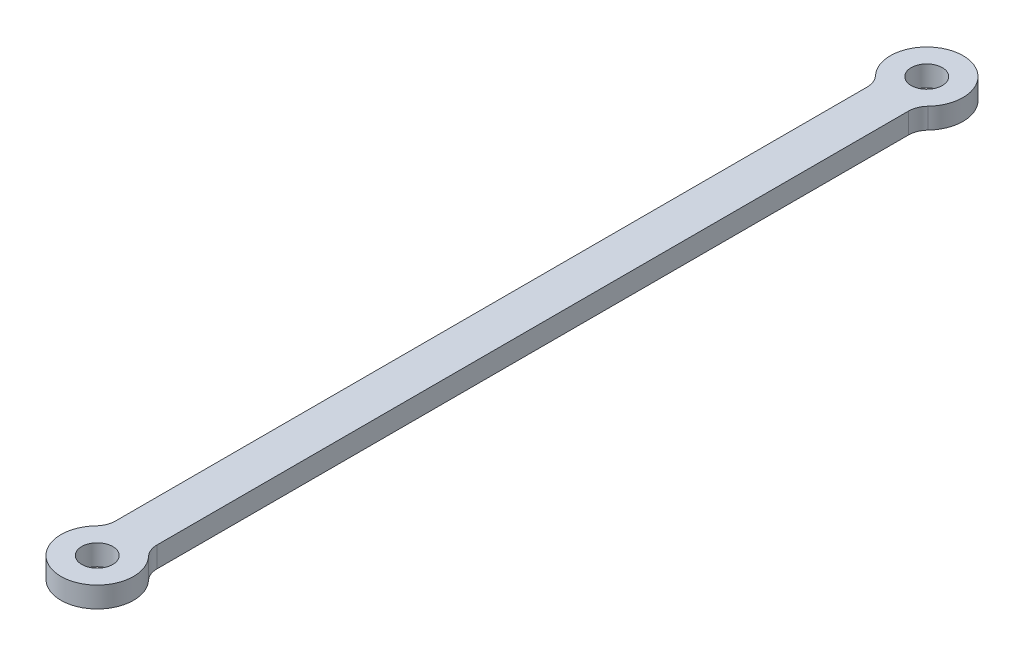
ISO-10303-21;
HEADER;
FILE_DESCRIPTION(('STEP AP214'),'2;1');
FILE_NAME('part.step','',(''),(''),'','','');
FILE_SCHEMA(('AUTOMOTIVE_DESIGN { 1 0 10303 214 1 1 1 1 }'));
ENDSEC;
DATA;
#1=APPLICATION_CONTEXT('core data for automotive mechanical design processes');
#2=APPLICATION_PROTOCOL_DEFINITION('international standard','automotive_design',2000,#1);
#3=PRODUCT_CONTEXT('',#1,'mechanical');
#4=PRODUCT('Part','Part','',(#3));
#5=PRODUCT_RELATED_PRODUCT_CATEGORY('part','',(#4));
#6=PRODUCT_DEFINITION_FORMATION('','',#4);
#7=PRODUCT_DEFINITION_CONTEXT('part definition',#1,'design');
#8=PRODUCT_DEFINITION('design','',#6,#7);
#9=PRODUCT_DEFINITION_SHAPE('','',#8);
#10=(LENGTH_UNIT() NAMED_UNIT(*) SI_UNIT(.MILLI.,.METRE.));
#11=(NAMED_UNIT(*) PLANE_ANGLE_UNIT() SI_UNIT($,.RADIAN.));
#12=(NAMED_UNIT(*) SI_UNIT($,.STERADIAN.) SOLID_ANGLE_UNIT());
#13=UNCERTAINTY_MEASURE_WITH_UNIT(LENGTH_MEASURE(1.E-05),#10,'distance_accuracy_value','');
#14=(GEOMETRIC_REPRESENTATION_CONTEXT(3) GLOBAL_UNCERTAINTY_ASSIGNED_CONTEXT((#13)) GLOBAL_UNIT_ASSIGNED_CONTEXT((#10,
#11,#12)) REPRESENTATION_CONTEXT('',''));
#15=CARTESIAN_POINT('',(0.,0.,0.));
#16=DIRECTION('',(0.,0.,1.));
#17=DIRECTION('',(1.,0.,0.));
#18=AXIS2_PLACEMENT_3D('',#15,#16,#17);
#19=CARTESIAN_POINT('',(0.,2.54,0.));
#20=DIRECTION('',(0.,1.,0.));
#21=DIRECTION('',(0.,0.,1.));
#22=AXIS2_PLACEMENT_3D('',#19,#20,#21);
#23=PLANE('',#22);
#24=CARTESIAN_POINT('',(0.,2.54,-101.6));
#25=DIRECTION('',(0.,1.,0.));
#26=DIRECTION('',(0.,0.,1.));
#27=AXIS2_PLACEMENT_3D('',#24,#25,#26);
#28=CIRCLE('',#27,1.905);
#29=CARTESIAN_POINT('',(0.,2.54,-99.695));
#30=VERTEX_POINT('',#29);
#31=EDGE_CURVE('E146',#30,#30,#28,.T.);
#32=ORIENTED_EDGE('',*,*,#31,.F.);
#33=EDGE_LOOP('',(#32));
#34=FACE_BOUND('',#33,.T.);
#35=DIRECTION('',(0.,0.,1.));
#36=VECTOR('',#35,1.);
#37=CARTESIAN_POINT('',(-2.54,2.54,-3.64779728055165));
#38=LINE('',#37,#36);
#39=CARTESIAN_POINT('',(-2.54,2.54,-96.8058551336031));
#40=VERTEX_POINT('',#39);
#41=CARTESIAN_POINT('',(-2.54,2.54,-4.79414486639693));
#42=VERTEX_POINT('',#41);
#43=EDGE_CURVE('E155',#40,#42,#38,.T.);
#44=ORIENTED_EDGE('',*,*,#43,.T.);
#45=CARTESIAN_POINT('',(-5.08,2.54,-4.79414486639693));
#46=DIRECTION('',(0.,1.,0.));
#47=DIRECTION('',(0.,0.,1.));
#48=AXIS2_PLACEMENT_3D('',#45,#46,#47);
#49=CIRCLE('',#48,2.54);
#50=CARTESIAN_POINT('',(-3.23272727272727,2.54,-3.05081946043441));
#51=VERTEX_POINT('',#50);
#52=EDGE_CURVE('E180',#42,#51,#49,.F.);
#53=ORIENTED_EDGE('',*,*,#52,.T.);
#54=CARTESIAN_POINT('',(0.,2.54,0.));
#55=DIRECTION('',(0.,1.,0.));
#56=DIRECTION('',(0.,0.,1.));
#57=AXIS2_PLACEMENT_3D('',#54,#55,#56);
#58=CIRCLE('',#57,4.445);
#59=CARTESIAN_POINT('',(3.23272727272727,2.54,-3.05081946043441));
#60=VERTEX_POINT('',#59);
#61=EDGE_CURVE('E153',#51,#60,#58,.T.);
#62=ORIENTED_EDGE('',*,*,#61,.T.);
#63=CARTESIAN_POINT('',(5.08,2.54,-4.79414486639693));
#64=DIRECTION('',(0.,1.,0.));
#65=DIRECTION('',(0.,0.,1.));
#66=AXIS2_PLACEMENT_3D('',#63,#64,#65);
#67=CIRCLE('',#66,2.54);
#68=CARTESIAN_POINT('',(2.54,2.54,-4.79414486639693));
#69=VERTEX_POINT('',#68);
#70=EDGE_CURVE('E122',#60,#69,#67,.F.);
#71=ORIENTED_EDGE('',*,*,#70,.T.);
#72=DIRECTION('',(0.,0.,-1.));
#73=VECTOR('',#72,1.);
#74=CARTESIAN_POINT('',(2.54,2.54,-3.64779728055165));
#75=LINE('',#74,#73);
#76=CARTESIAN_POINT('',(2.54,2.54,-96.8058551336031));
#77=VERTEX_POINT('',#76);
#78=EDGE_CURVE('E130',#69,#77,#75,.T.);
#79=ORIENTED_EDGE('',*,*,#78,.T.);
#80=CARTESIAN_POINT('',(5.08,2.54,-96.8058551336031));
#81=DIRECTION('',(0.,1.,0.));
#82=DIRECTION('',(0.,0.,1.));
#83=AXIS2_PLACEMENT_3D('',#80,#81,#82);
#84=CIRCLE('',#83,2.54);
#85=CARTESIAN_POINT('',(3.23272727272727,2.54,-98.5491805395656));
#86=VERTEX_POINT('',#85);
#87=EDGE_CURVE('E11',#77,#86,#84,.F.);
#88=ORIENTED_EDGE('',*,*,#87,.T.);
#89=CARTESIAN_POINT('',(0.,2.54,-101.6));
#90=DIRECTION('',(0.,1.,0.));
#91=DIRECTION('',(0.,0.,1.));
#92=AXIS2_PLACEMENT_3D('',#89,#90,#91);
#93=CIRCLE('',#92,4.445);
#94=CARTESIAN_POINT('',(-3.23272727272727,2.54,-98.5491805395656));
#95=VERTEX_POINT('',#94);
#96=EDGE_CURVE('E192',#86,#95,#93,.T.);
#97=ORIENTED_EDGE('',*,*,#96,.T.);
#98=CARTESIAN_POINT('',(-5.08,2.54,-96.8058551336031));
#99=DIRECTION('',(0.,1.,0.));
#100=DIRECTION('',(0.,0.,1.));
#101=AXIS2_PLACEMENT_3D('',#98,#99,#100);
#102=CIRCLE('',#101,2.54);
#103=EDGE_CURVE('E186',#95,#40,#102,.F.);
#104=ORIENTED_EDGE('',*,*,#103,.T.);
#105=EDGE_LOOP('',(#44,#53,#62,#71,#79,#88,#97,#104));
#106=FACE_BOUND('',#105,.T.);
#107=CARTESIAN_POINT('',(0.,2.54,0.));
#108=DIRECTION('',(0.,1.,0.));
#109=DIRECTION('',(0.,0.,1.));
#110=AXIS2_PLACEMENT_3D('',#107,#108,#109);
#111=CIRCLE('',#110,1.905);
#112=CARTESIAN_POINT('',(0.,2.54,1.905));
#113=VERTEX_POINT('',#112);
#114=EDGE_CURVE('E205',#113,#113,#111,.T.);
#115=ORIENTED_EDGE('',*,*,#114,.F.);
#116=EDGE_LOOP('',(#115));
#117=FACE_BOUND('',#116,.T.);
#118=ADVANCED_FACE('F45',(#34,#106,#117),#23,.T.);
#119=CARTESIAN_POINT('',(0.,0.,0.));
#120=DIRECTION('',(0.,1.,0.));
#121=DIRECTION('',(0.,0.,1.));
#122=AXIS2_PLACEMENT_3D('',#119,#120,#121);
#123=PLANE('',#122);
#124=CARTESIAN_POINT('',(0.,0.,0.));
#125=DIRECTION('',(0.,1.,0.));
#126=DIRECTION('',(0.,0.,1.));
#127=AXIS2_PLACEMENT_3D('',#124,#125,#126);
#128=CIRCLE('',#127,4.445);
#129=CARTESIAN_POINT('',(-3.23272727272727,0.,-3.05081946043441));
#130=VERTEX_POINT('',#129);
#131=CARTESIAN_POINT('',(3.23272727272727,0.,-3.05081946043441));
#132=VERTEX_POINT('',#131);
#133=EDGE_CURVE('E140',#130,#132,#128,.T.);
#134=ORIENTED_EDGE('',*,*,#133,.F.);
#135=CARTESIAN_POINT('',(-5.08,0.,-4.79414486639693));
#136=DIRECTION('',(0.,1.,0.));
#137=DIRECTION('',(0.,0.,1.));
#138=AXIS2_PLACEMENT_3D('',#135,#136,#137);
#139=CIRCLE('',#138,2.54);
#140=CARTESIAN_POINT('',(-2.54,0.,-4.79414486639693));
#141=VERTEX_POINT('',#140);
#142=EDGE_CURVE('E177',#130,#141,#139,.T.);
#143=ORIENTED_EDGE('',*,*,#142,.T.);
#144=DIRECTION('',(0.,0.,1.));
#145=VECTOR('',#144,1.);
#146=CARTESIAN_POINT('',(-2.54,0.,-3.64779728055165));
#147=LINE('',#146,#145);
#148=CARTESIAN_POINT('',(-2.54,0.,-96.8058551336031));
#149=VERTEX_POINT('',#148);
#150=EDGE_CURVE('E144',#149,#141,#147,.T.);
#151=ORIENTED_EDGE('',*,*,#150,.F.);
#152=CARTESIAN_POINT('',(-5.08,0.,-96.8058551336031));
#153=DIRECTION('',(0.,1.,0.));
#154=DIRECTION('',(0.,0.,1.));
#155=AXIS2_PLACEMENT_3D('',#152,#153,#154);
#156=CIRCLE('',#155,2.54);
#157=CARTESIAN_POINT('',(-3.23272727272727,0.,-98.5491805395656));
#158=VERTEX_POINT('',#157);
#159=EDGE_CURVE('E183',#149,#158,#156,.T.);
#160=ORIENTED_EDGE('',*,*,#159,.T.);
#161=CARTESIAN_POINT('',(0.,0.,-101.6));
#162=DIRECTION('',(0.,1.,0.));
#163=DIRECTION('',(0.,0.,1.));
#164=AXIS2_PLACEMENT_3D('',#161,#162,#163);
#165=CIRCLE('',#164,4.445);
#166=CARTESIAN_POINT('',(3.23272727272727,0.,-98.5491805395656));
#167=VERTEX_POINT('',#166);
#168=EDGE_CURVE('E139',#167,#158,#165,.T.);
#169=ORIENTED_EDGE('',*,*,#168,.F.);
#170=CARTESIAN_POINT('',(5.08,0.,-96.8058551336031));
#171=DIRECTION('',(0.,1.,0.));
#172=DIRECTION('',(0.,0.,1.));
#173=AXIS2_PLACEMENT_3D('',#170,#171,#172);
#174=CIRCLE('',#173,2.54);
#175=CARTESIAN_POINT('',(2.54,0.,-96.8058551336031));
#176=VERTEX_POINT('',#175);
#177=EDGE_CURVE('E54',#167,#176,#174,.T.);
#178=ORIENTED_EDGE('',*,*,#177,.T.);
#179=DIRECTION('',(0.,0.,-1.));
#180=VECTOR('',#179,1.);
#181=CARTESIAN_POINT('',(2.54,0.,-3.64779728055165));
#182=LINE('',#181,#180);
#183=CARTESIAN_POINT('',(2.54,0.,-4.79414486639693));
#184=VERTEX_POINT('',#183);
#185=EDGE_CURVE('E128',#184,#176,#182,.T.);
#186=ORIENTED_EDGE('',*,*,#185,.F.);
#187=CARTESIAN_POINT('',(5.08,0.,-4.79414486639693));
#188=DIRECTION('',(0.,1.,0.));
#189=DIRECTION('',(0.,0.,1.));
#190=AXIS2_PLACEMENT_3D('',#187,#188,#189);
#191=CIRCLE('',#190,2.54);
#192=EDGE_CURVE('E111',#184,#132,#191,.T.);
#193=ORIENTED_EDGE('',*,*,#192,.T.);
#194=EDGE_LOOP('',(#134,#143,#151,#160,#169,#178,#186,#193));
#195=FACE_BOUND('',#194,.T.);
#196=CARTESIAN_POINT('',(0.,0.,-101.6));
#197=DIRECTION('',(0.,1.,0.));
#198=DIRECTION('',(0.,0.,1.));
#199=AXIS2_PLACEMENT_3D('',#196,#197,#198);
#200=CIRCLE('',#199,1.905);
#201=CARTESIAN_POINT('',(0.,0.,-99.695));
#202=VERTEX_POINT('',#201);
#203=EDGE_CURVE('E201',#202,#202,#200,.T.);
#204=ORIENTED_EDGE('',*,*,#203,.T.);
#205=EDGE_LOOP('',(#204));
#206=FACE_BOUND('',#205,.T.);
#207=CARTESIAN_POINT('',(0.,0.,0.));
#208=DIRECTION('',(0.,1.,0.));
#209=DIRECTION('',(0.,0.,1.));
#210=AXIS2_PLACEMENT_3D('',#207,#208,#209);
#211=CIRCLE('',#210,1.905);
#212=CARTESIAN_POINT('',(0.,0.,1.905));
#213=VERTEX_POINT('',#212);
#214=EDGE_CURVE('E209',#213,#213,#211,.T.);
#215=ORIENTED_EDGE('',*,*,#214,.T.);
#216=EDGE_LOOP('',(#215));
#217=FACE_BOUND('',#216,.T.);
#218=ADVANCED_FACE('F135',(#195,#206,#217),#123,.F.);
#219=CARTESIAN_POINT('',(0.,2.54,0.));
#220=DIRECTION('',(0.,-1.,0.));
#221=DIRECTION('',(0.,0.,-1.));
#222=AXIS2_PLACEMENT_3D('',#219,#220,#221);
#223=CYLINDRICAL_SURFACE('',#222,4.445);
#224=ORIENTED_EDGE('',*,*,#133,.T.);
#225=DIRECTION('',(0.,-1.,0.));
#226=VECTOR('',#225,1.);
#227=CARTESIAN_POINT('',(3.23272727272727,2.54,-3.05081946043441));
#228=LINE('',#227,#226);
#229=EDGE_CURVE('E116',#132,#60,#228,.F.);
#230=ORIENTED_EDGE('',*,*,#229,.T.);
#231=ORIENTED_EDGE('',*,*,#61,.F.);
#232=DIRECTION('',(0.,-1.,0.));
#233=VECTOR('',#232,1.);
#234=CARTESIAN_POINT('',(-3.23272727272727,2.54,-3.05081946043441));
#235=LINE('',#234,#233);
#236=EDGE_CURVE('E132',#51,#130,#235,.T.);
#237=ORIENTED_EDGE('',*,*,#236,.T.);
#238=EDGE_LOOP('',(#224,#230,#231,#237));
#239=FACE_BOUND('',#238,.T.);
#240=ADVANCED_FACE('F227',(#239),#223,.T.);
#241=CARTESIAN_POINT('',(2.54,2.54,-3.64779728055165));
#242=DIRECTION('',(-1.,0.,0.));
#243=DIRECTION('',(0.,0.,1.));
#244=AXIS2_PLACEMENT_3D('',#241,#242,#243);
#245=PLANE('',#244);
#246=ORIENTED_EDGE('',*,*,#78,.F.);
#247=DIRECTION('',(0.,1.,0.));
#248=VECTOR('',#247,1.);
#249=CARTESIAN_POINT('',(2.54,0.,-4.79414486639693));
#250=LINE('',#249,#248);
#251=EDGE_CURVE('E115',#69,#184,#250,.F.);
#252=ORIENTED_EDGE('',*,*,#251,.T.);
#253=ORIENTED_EDGE('',*,*,#185,.T.);
#254=DIRECTION('',(0.,1.,0.));
#255=VECTOR('',#254,1.);
#256=CARTESIAN_POINT('',(2.54,2.54,-96.8058551336031));
#257=LINE('',#256,#255);
#258=EDGE_CURVE('E133',#176,#77,#257,.T.);
#259=ORIENTED_EDGE('',*,*,#258,.T.);
#260=EDGE_LOOP('',(#246,#252,#253,#259));
#261=FACE_BOUND('',#260,.T.);
#262=ADVANCED_FACE('F127',(#261),#245,.F.);
#263=CARTESIAN_POINT('',(0.,2.54,-101.6));
#264=DIRECTION('',(0.,-1.,0.));
#265=DIRECTION('',(0.,0.,-1.));
#266=AXIS2_PLACEMENT_3D('',#263,#264,#265);
#267=CYLINDRICAL_SURFACE('',#266,4.445);
#268=ORIENTED_EDGE('',*,*,#168,.T.);
#269=DIRECTION('',(0.,-1.,0.));
#270=VECTOR('',#269,1.);
#271=CARTESIAN_POINT('',(-3.23272727272727,2.54,-98.5491805395656));
#272=LINE('',#271,#270);
#273=EDGE_CURVE('E61',#158,#95,#272,.F.);
#274=ORIENTED_EDGE('',*,*,#273,.T.);
#275=ORIENTED_EDGE('',*,*,#96,.F.);
#276=DIRECTION('',(0.,-1.,0.));
#277=VECTOR('',#276,1.);
#278=CARTESIAN_POINT('',(3.23272727272727,2.54,-98.5491805395656));
#279=LINE('',#278,#277);
#280=EDGE_CURVE('E169',#86,#167,#279,.T.);
#281=ORIENTED_EDGE('',*,*,#280,.T.);
#282=EDGE_LOOP('',(#268,#274,#275,#281));
#283=FACE_BOUND('',#282,.T.);
#284=ADVANCED_FACE('F237',(#283),#267,.T.);
#285=CARTESIAN_POINT('',(-2.54,2.54,-3.64779728055165));
#286=DIRECTION('',(1.,0.,0.));
#287=DIRECTION('',(0.,0.,-1.));
#288=AXIS2_PLACEMENT_3D('',#285,#286,#287);
#289=PLANE('',#288);
#290=ORIENTED_EDGE('',*,*,#150,.T.);
#291=DIRECTION('',(0.,1.,0.));
#292=VECTOR('',#291,1.);
#293=CARTESIAN_POINT('',(-2.54,2.54,-4.79414486639693));
#294=LINE('',#293,#292);
#295=EDGE_CURVE('E166',#141,#42,#294,.T.);
#296=ORIENTED_EDGE('',*,*,#295,.T.);
#297=ORIENTED_EDGE('',*,*,#43,.F.);
#298=DIRECTION('',(0.,1.,0.));
#299=VECTOR('',#298,1.);
#300=CARTESIAN_POINT('',(-2.54,0.,-96.8058551336031));
#301=LINE('',#300,#299);
#302=EDGE_CURVE('E162',#40,#149,#301,.F.);
#303=ORIENTED_EDGE('',*,*,#302,.T.);
#304=EDGE_LOOP('',(#290,#296,#297,#303));
#305=FACE_BOUND('',#304,.T.);
#306=ADVANCED_FACE('F234',(#305),#289,.F.);
#307=CARTESIAN_POINT('',(0.,2.54,-101.6));
#308=DIRECTION('',(0.,-1.,0.));
#309=DIRECTION('',(0.,0.,-1.));
#310=AXIS2_PLACEMENT_3D('',#307,#308,#309);
#311=CYLINDRICAL_SURFACE('',#310,1.905);
#312=ORIENTED_EDGE('',*,*,#31,.T.);
#313=EDGE_LOOP('',(#312));
#314=FACE_BOUND('',#313,.T.);
#315=ORIENTED_EDGE('',*,*,#203,.F.);
#316=EDGE_LOOP('',(#315));
#317=FACE_BOUND('',#316,.T.);
#318=ADVANCED_FACE('F231',(#314,#317),#311,.F.);
#319=CARTESIAN_POINT('',(0.,2.54,0.));
#320=DIRECTION('',(0.,-1.,0.));
#321=DIRECTION('',(0.,0.,-1.));
#322=AXIS2_PLACEMENT_3D('',#319,#320,#321);
#323=CYLINDRICAL_SURFACE('',#322,1.905);
#324=ORIENTED_EDGE('',*,*,#114,.T.);
#325=EDGE_LOOP('',(#324));
#326=FACE_BOUND('',#325,.T.);
#327=ORIENTED_EDGE('',*,*,#214,.F.);
#328=EDGE_LOOP('',(#327));
#329=FACE_BOUND('',#328,.T.);
#330=ADVANCED_FACE('F217',(#326,#329),#323,.F.);
#331=CARTESIAN_POINT('',(5.08,2.54,-4.79414486639693));
#332=DIRECTION('',(0.,-1.,0.));
#333=DIRECTION('',(0.,0.,-1.));
#334=AXIS2_PLACEMENT_3D('',#331,#332,#333);
#335=CYLINDRICAL_SURFACE('',#334,2.54);
#336=ORIENTED_EDGE('',*,*,#70,.F.);
#337=ORIENTED_EDGE('',*,*,#229,.F.);
#338=ORIENTED_EDGE('',*,*,#192,.F.);
#339=ORIENTED_EDGE('',*,*,#251,.F.);
#340=EDGE_LOOP('',(#336,#337,#338,#339));
#341=FACE_BOUND('',#340,.T.);
#342=ADVANCED_FACE('F114',(#341),#335,.F.);
#343=CARTESIAN_POINT('',(-5.08,2.54,-4.79414486639693));
#344=DIRECTION('',(0.,-1.,0.));
#345=DIRECTION('',(0.,0.,-1.));
#346=AXIS2_PLACEMENT_3D('',#343,#344,#345);
#347=CYLINDRICAL_SURFACE('',#346,2.54);
#348=ORIENTED_EDGE('',*,*,#52,.F.);
#349=ORIENTED_EDGE('',*,*,#295,.F.);
#350=ORIENTED_EDGE('',*,*,#142,.F.);
#351=ORIENTED_EDGE('',*,*,#236,.F.);
#352=EDGE_LOOP('',(#348,#349,#350,#351));
#353=FACE_BOUND('',#352,.T.);
#354=ADVANCED_FACE('F248',(#353),#347,.F.);
#355=CARTESIAN_POINT('',(-5.08,2.54,-96.8058551336031));
#356=DIRECTION('',(0.,-1.,0.));
#357=DIRECTION('',(0.,0.,-1.));
#358=AXIS2_PLACEMENT_3D('',#355,#356,#357);
#359=CYLINDRICAL_SURFACE('',#358,2.54);
#360=ORIENTED_EDGE('',*,*,#103,.F.);
#361=ORIENTED_EDGE('',*,*,#273,.F.);
#362=ORIENTED_EDGE('',*,*,#159,.F.);
#363=ORIENTED_EDGE('',*,*,#302,.F.);
#364=EDGE_LOOP('',(#360,#361,#362,#363));
#365=FACE_BOUND('',#364,.T.);
#366=ADVANCED_FACE('F250',(#365),#359,.F.);
#367=CARTESIAN_POINT('',(5.08,2.54,-96.8058551336031));
#368=DIRECTION('',(0.,-1.,0.));
#369=DIRECTION('',(0.,0.,-1.));
#370=AXIS2_PLACEMENT_3D('',#367,#368,#369);
#371=CYLINDRICAL_SURFACE('',#370,2.54);
#372=ORIENTED_EDGE('',*,*,#87,.F.);
#373=ORIENTED_EDGE('',*,*,#258,.F.);
#374=ORIENTED_EDGE('',*,*,#177,.F.);
#375=ORIENTED_EDGE('',*,*,#280,.F.);
#376=EDGE_LOOP('',(#372,#373,#374,#375));
#377=FACE_BOUND('',#376,.T.);
#378=ADVANCED_FACE('F47',(#377),#371,.F.);
#379=CLOSED_SHELL('',(#118,#218,#240,#262,#284,#306,#318,#330,#342,#354,#366,#378));
#380=MANIFOLD_SOLID_BREP('B2',#379);
#381=ADVANCED_BREP_SHAPE_REPRESENTATION('',(#18,#380),#14);
#382=SHAPE_DEFINITION_REPRESENTATION(#9,#381);
ENDSEC;
END-ISO-10303-21;
